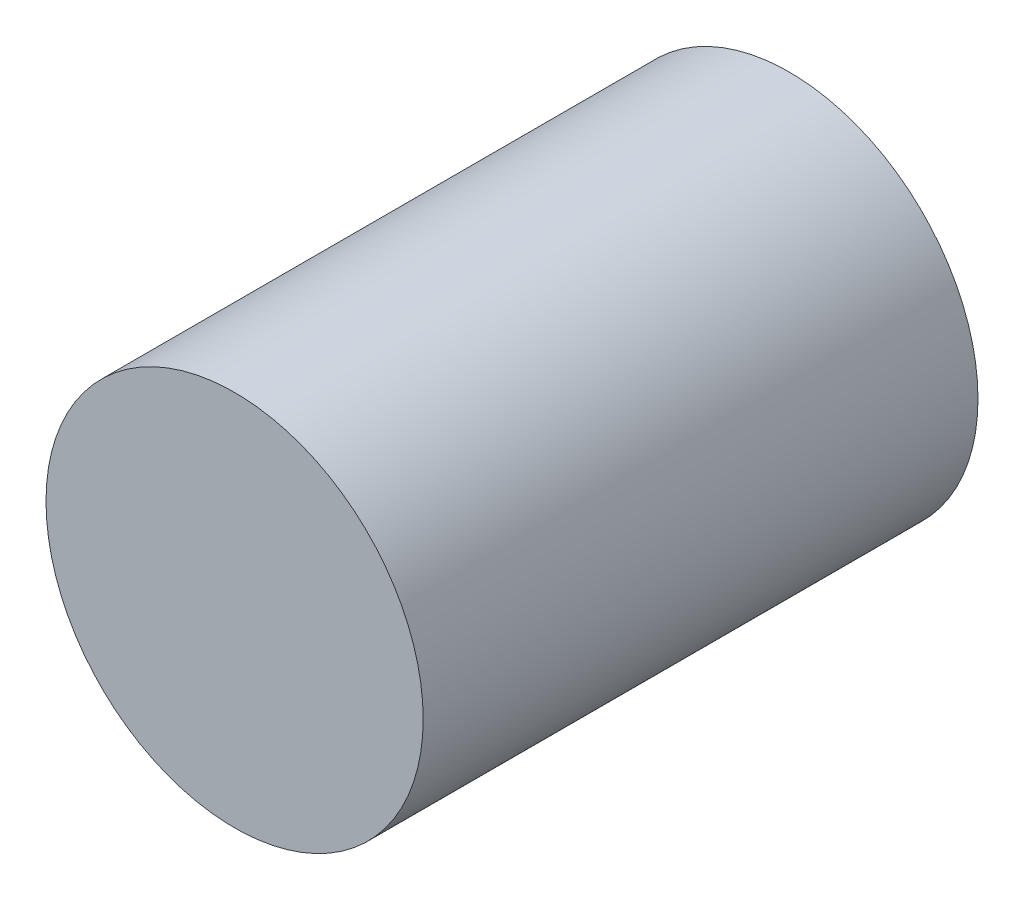
ISO-10303-21;
HEADER;
FILE_DESCRIPTION(('STEP AP214'),'2;1');
FILE_NAME('part.step','',(''),(''),'','','');
FILE_SCHEMA(('AUTOMOTIVE_DESIGN { 1 0 10303 214 1 1 1 1 }'));
ENDSEC;
DATA;
#1=APPLICATION_CONTEXT('core data for automotive mechanical design processes');
#2=APPLICATION_PROTOCOL_DEFINITION('international standard','automotive_design',2000,#1);
#3=PRODUCT_CONTEXT('',#1,'mechanical');
#4=PRODUCT('Part','Part','',(#3));
#5=PRODUCT_RELATED_PRODUCT_CATEGORY('part','',(#4));
#6=PRODUCT_DEFINITION_FORMATION('','',#4);
#7=PRODUCT_DEFINITION_CONTEXT('part definition',#1,'design');
#8=PRODUCT_DEFINITION('design','',#6,#7);
#9=PRODUCT_DEFINITION_SHAPE('','',#8);
#10=(LENGTH_UNIT() NAMED_UNIT(*) SI_UNIT(.MILLI.,.METRE.));
#11=(NAMED_UNIT(*) PLANE_ANGLE_UNIT() SI_UNIT($,.RADIAN.));
#12=(NAMED_UNIT(*) SI_UNIT($,.STERADIAN.) SOLID_ANGLE_UNIT());
#13=UNCERTAINTY_MEASURE_WITH_UNIT(LENGTH_MEASURE(1.E-05),#10,'distance_accuracy_value','');
#14=(GEOMETRIC_REPRESENTATION_CONTEXT(3) GLOBAL_UNCERTAINTY_ASSIGNED_CONTEXT((#13)) GLOBAL_UNIT_ASSIGNED_CONTEXT((#10,
#11,#12)) REPRESENTATION_CONTEXT('',''));
#15=CARTESIAN_POINT('',(0.,0.,0.));
#16=DIRECTION('',(0.,0.,1.));
#17=DIRECTION('',(1.,0.,0.));
#18=AXIS2_PLACEMENT_3D('',#15,#16,#17);
#19=CARTESIAN_POINT('',(0.,0.,80.9));
#20=DIRECTION('',(0.,0.,-1.));
#21=DIRECTION('',(-1.,0.,0.));
#22=AXIS2_PLACEMENT_3D('',#19,#20,#21);
#23=CYLINDRICAL_SURFACE('',#22,27.5);
#24=CARTESIAN_POINT('',(0.,0.,80.9));
#25=DIRECTION('',(0.,0.,1.));
#26=DIRECTION('',(1.,0.,0.));
#27=AXIS2_PLACEMENT_3D('',#24,#25,#26);
#28=CIRCLE('',#27,27.5);
#29=CARTESIAN_POINT('',(27.5,0.,80.9));
#30=VERTEX_POINT('',#29);
#31=EDGE_CURVE('E10',#30,#30,#28,.T.);
#32=ORIENTED_EDGE('',*,*,#31,.F.);
#33=EDGE_LOOP('',(#32));
#34=FACE_BOUND('',#33,.T.);
#35=CARTESIAN_POINT('',(0.,0.,0.));
#36=DIRECTION('',(0.,0.,1.));
#37=DIRECTION('',(1.,0.,0.));
#38=AXIS2_PLACEMENT_3D('',#35,#36,#37);
#39=CIRCLE('',#38,27.5);
#40=CARTESIAN_POINT('',(27.5,0.,0.));
#41=VERTEX_POINT('',#40);
#42=EDGE_CURVE('E40',#41,#41,#39,.T.);
#43=ORIENTED_EDGE('',*,*,#42,.T.);
#44=EDGE_LOOP('',(#43));
#45=FACE_BOUND('',#44,.T.);
#46=ADVANCED_FACE('F37',(#34,#45),#23,.T.);
#47=CARTESIAN_POINT('',(0.,0.,80.9));
#48=DIRECTION('',(0.,0.,1.));
#49=DIRECTION('',(1.,0.,0.));
#50=AXIS2_PLACEMENT_3D('',#47,#48,#49);
#51=PLANE('',#50);
#52=ORIENTED_EDGE('',*,*,#31,.T.);
#53=EDGE_LOOP('',(#52));
#54=FACE_BOUND('',#53,.T.);
#55=ADVANCED_FACE('F54',(#54),#51,.T.);
#56=CARTESIAN_POINT('',(0.,0.,0.));
#57=DIRECTION('',(0.,0.,1.));
#58=DIRECTION('',(1.,0.,0.));
#59=AXIS2_PLACEMENT_3D('',#56,#57,#58);
#60=PLANE('',#59);
#61=ORIENTED_EDGE('',*,*,#42,.F.);
#62=EDGE_LOOP('',(#61));
#63=FACE_BOUND('',#62,.T.);
#64=ADVANCED_FACE('F52',(#63),#60,.F.);
#65=CLOSED_SHELL('',(#46,#55,#64));
#66=MANIFOLD_SOLID_BREP('B2',#65);
#67=ADVANCED_BREP_SHAPE_REPRESENTATION('',(#18,#66),#14);
#68=SHAPE_DEFINITION_REPRESENTATION(#9,#67);
ENDSEC;
END-ISO-10303-21;
